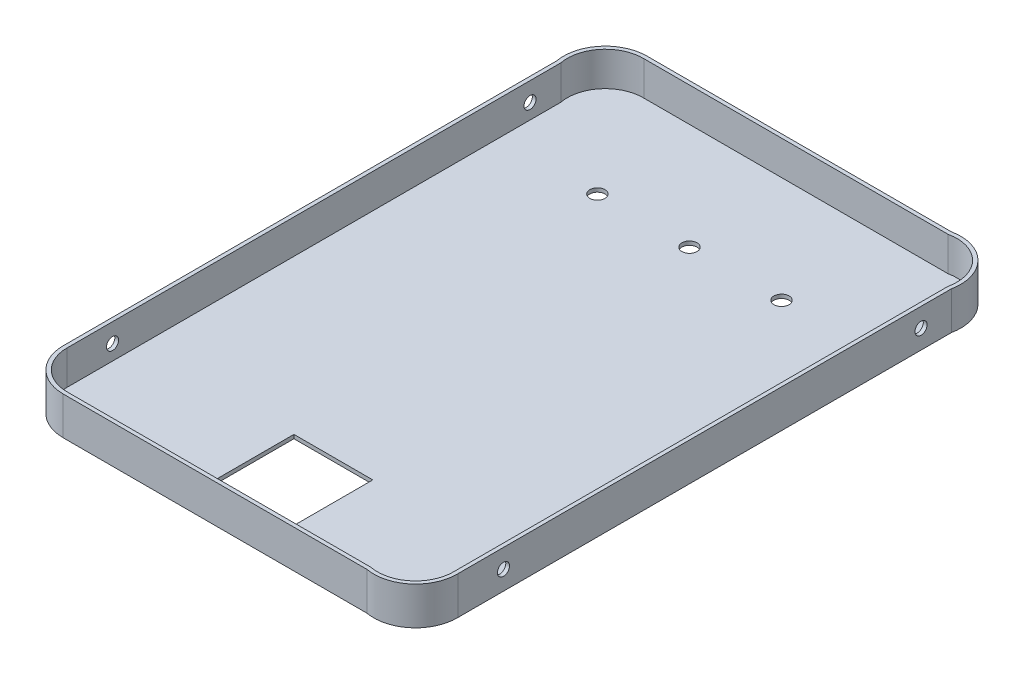
ISO-10303-21;
HEADER;
FILE_DESCRIPTION(('STEP AP214'),'2;1');
FILE_NAME('part.step','',(''),(''),'','','');
FILE_SCHEMA(('AUTOMOTIVE_DESIGN { 1 0 10303 214 1 1 1 1 }'));
ENDSEC;
DATA;
#1=APPLICATION_CONTEXT('core data for automotive mechanical design processes');
#2=APPLICATION_PROTOCOL_DEFINITION('international standard','automotive_design',2000,#1);
#3=PRODUCT_CONTEXT('',#1,'mechanical');
#4=PRODUCT('Part','Part','',(#3));
#5=PRODUCT_RELATED_PRODUCT_CATEGORY('part','',(#4));
#6=PRODUCT_DEFINITION_FORMATION('','',#4);
#7=PRODUCT_DEFINITION_CONTEXT('part definition',#1,'design');
#8=PRODUCT_DEFINITION('design','',#6,#7);
#9=PRODUCT_DEFINITION_SHAPE('','',#8);
#10=(LENGTH_UNIT() NAMED_UNIT(*) SI_UNIT(.MILLI.,.METRE.));
#11=(NAMED_UNIT(*) PLANE_ANGLE_UNIT() SI_UNIT($,.RADIAN.));
#12=(NAMED_UNIT(*) SI_UNIT($,.STERADIAN.) SOLID_ANGLE_UNIT());
#13=UNCERTAINTY_MEASURE_WITH_UNIT(LENGTH_MEASURE(1.E-05),#10,'distance_accuracy_value','');
#14=(GEOMETRIC_REPRESENTATION_CONTEXT(3) GLOBAL_UNCERTAINTY_ASSIGNED_CONTEXT((#13)) GLOBAL_UNIT_ASSIGNED_CONTEXT((#10,
#11,#12)) REPRESENTATION_CONTEXT('',''));
#15=CARTESIAN_POINT('',(0.,0.,0.));
#16=DIRECTION('',(0.,0.,1.));
#17=DIRECTION('',(1.,0.,0.));
#18=AXIS2_PLACEMENT_3D('',#15,#16,#17);
#19=CARTESIAN_POINT('',(-30.4217249440461,0.,-61.1681994947788));
#20=DIRECTION('',(0.,1.,0.));
#21=DIRECTION('',(0.,0.,1.));
#22=AXIS2_PLACEMENT_3D('',#19,#20,#21);
#23=PLANE('',#22);
#24=CARTESIAN_POINT('',(9.76190476190476,0.,-43.1640364931666));
#25=DIRECTION('',(0.,-1.,0.));
#26=DIRECTION('',(0.,0.,-1.));
#27=AXIS2_PLACEMENT_3D('',#24,#25,#26);
#28=CIRCLE('',#27,2.);
#29=CARTESIAN_POINT('',(9.76190476190476,0.,-45.1640364931666));
#30=VERTEX_POINT('',#29);
#31=EDGE_CURVE('E668',#30,#30,#28,.T.);
#32=ORIENTED_EDGE('',*,*,#31,.F.);
#33=EDGE_LOOP('',(#32));
#34=FACE_BOUND('',#33,.T.);
#35=CARTESIAN_POINT('',(-14.4880952380952,0.,-43.1640364931666));
#36=DIRECTION('',(0.,-1.,0.));
#37=DIRECTION('',(0.,0.,-1.));
#38=AXIS2_PLACEMENT_3D('',#35,#36,#37);
#39=CIRCLE('',#38,2.);
#40=CARTESIAN_POINT('',(-14.4880952380952,0.,-45.1640364931666));
#41=VERTEX_POINT('',#40);
#42=EDGE_CURVE('E203',#41,#41,#39,.T.);
#43=ORIENTED_EDGE('',*,*,#42,.F.);
#44=EDGE_LOOP('',(#43));
#45=FACE_BOUND('',#44,.T.);
#46=CARTESIAN_POINT('',(-30.4217249440461,0.,-61.1681994947788));
#47=DIRECTION('',(0.,1.,0.));
#48=DIRECTION('',(0.,0.,1.));
#49=AXIS2_PLACEMENT_3D('',#46,#47,#48);
#50=CIRCLE('',#49,11.);
#51=CARTESIAN_POINT('',(-30.2380952380952,0.,-72.1666666666666));
#52=VERTEX_POINT('',#51);
#53=CARTESIAN_POINT('',(-41.2380952380952,0.,-59.1666666666665));
#54=VERTEX_POINT('',#53);
#55=EDGE_CURVE('E239',#52,#54,#50,.T.);
#56=ORIENTED_EDGE('',*,*,#55,.F.);
#57=DIRECTION('',(-1.,0.,0.));
#58=VECTOR('',#57,1.);
#59=CARTESIAN_POINT('',(-30.2380952380952,0.,-72.1666666666666));
#60=LINE('',#59,#58);
#61=CARTESIAN_POINT('',(49.7619047619047,0.,-72.1666666666666));
#62=VERTEX_POINT('',#61);
#63=EDGE_CURVE('E298',#62,#52,#60,.T.);
#64=ORIENTED_EDGE('',*,*,#63,.F.);
#65=CARTESIAN_POINT('',(51.989902889246,0.,-61.3946647940078));
#66=DIRECTION('',(0.,1.,0.));
#67=DIRECTION('',(0.,0.,-1.));
#68=AXIS2_PLACEMENT_3D('',#65,#66,#67);
#69=CIRCLE('',#68,11.);
#70=CARTESIAN_POINT('',(62.7619047619048,0.,-59.1666666666665));
#71=VERTEX_POINT('',#70);
#72=EDGE_CURVE('E324',#71,#62,#69,.T.);
#73=ORIENTED_EDGE('',*,*,#72,.F.);
#74=DIRECTION('',(0.,0.,-1.));
#75=VECTOR('',#74,1.);
#76=CARTESIAN_POINT('',(62.7619047619048,0.,-59.1666666666665));
#77=LINE('',#76,#75);
#78=CARTESIAN_POINT('',(62.7619047619048,0.,70.8333333333333));
#79=VERTEX_POINT('',#78);
#80=EDGE_CURVE('E322',#79,#71,#77,.T.);
#81=ORIENTED_EDGE('',*,*,#80,.F.);
#82=CARTESIAN_POINT('',(51.763437590017,0.,71.0169630392843));
#83=DIRECTION('',(0.,1.,0.));
#84=DIRECTION('',(0.,0.,1.));
#85=AXIS2_PLACEMENT_3D('',#82,#83,#84);
#86=CIRCLE('',#85,11.);
#87=CARTESIAN_POINT('',(49.7619047619047,0.,81.8333333333334));
#88=VERTEX_POINT('',#87);
#89=EDGE_CURVE('E316',#88,#79,#86,.T.);
#90=ORIENTED_EDGE('',*,*,#89,.F.);
#91=DIRECTION('',(1.,0.,0.));
#92=VECTOR('',#91,1.);
#93=CARTESIAN_POINT('',(-30.2380952380951,0.,81.8333333333334));
#94=LINE('',#93,#92);
#95=CARTESIAN_POINT('',(-30.2380952380952,0.,81.8333333333334));
#96=VERTEX_POINT('',#95);
#97=EDGE_CURVE('E320',#96,#88,#94,.T.);
#98=ORIENTED_EDGE('',*,*,#97,.F.);
#99=CARTESIAN_POINT('',(-30.2380952380952,0.,70.8333333333334));
#100=DIRECTION('',(0.,1.,0.));
#101=DIRECTION('',(0.,0.,1.));
#102=AXIS2_PLACEMENT_3D('',#99,#100,#101);
#103=CIRCLE('',#102,11.);
#104=CARTESIAN_POINT('',(-41.2380952380952,0.,70.8333333333333));
#105=VERTEX_POINT('',#104);
#106=EDGE_CURVE('E314',#105,#96,#103,.T.);
#107=ORIENTED_EDGE('',*,*,#106,.F.);
#108=DIRECTION('',(0.,0.,1.));
#109=VECTOR('',#108,1.);
#110=CARTESIAN_POINT('',(-41.2380952380952,0.,-59.1666666666665));
#111=LINE('',#110,#109);
#112=EDGE_CURVE('E312',#54,#105,#111,.T.);
#113=ORIENTED_EDGE('',*,*,#112,.F.);
#114=EDGE_LOOP('',(#56,#64,#73,#81,#90,#98,#107,#113));
#115=FACE_BOUND('',#114,.T.);
#116=DIRECTION('',(1.,0.,0.));
#117=VECTOR('',#116,1.);
#118=CARTESIAN_POINT('',(0.375617944177974,0.,72.0118944147057));
#119=LINE('',#118,#117);
#120=CARTESIAN_POINT('',(0.375617944177974,0.,72.0118944147057));
#121=VERTEX_POINT('',#120);
#122=CARTESIAN_POINT('',(21.1481915796316,0.,72.0118944147057));
#123=VERTEX_POINT('',#122);
#124=EDGE_CURVE('E59',#121,#123,#119,.T.);
#125=ORIENTED_EDGE('',*,*,#124,.T.);
#126=DIRECTION('',(0.,0.,-1.));
#127=VECTOR('',#126,1.);
#128=CARTESIAN_POINT('',(21.1481915796316,0.,72.0118944147057));
#129=LINE('',#128,#127);
#130=CARTESIAN_POINT('',(21.1481915796316,0.,51.6547722519611));
#131=VERTEX_POINT('',#130);
#132=EDGE_CURVE('E189',#123,#131,#129,.T.);
#133=ORIENTED_EDGE('',*,*,#132,.T.);
#134=DIRECTION('',(1.,0.,0.));
#135=VECTOR('',#134,1.);
#136=CARTESIAN_POINT('',(0.375617944177974,0.,51.6547722519611));
#137=LINE('',#136,#135);
#138=CARTESIAN_POINT('',(0.375617944177974,0.,51.6547722519611));
#139=VERTEX_POINT('',#138);
#140=EDGE_CURVE('E191',#139,#131,#137,.T.);
#141=ORIENTED_EDGE('',*,*,#140,.F.);
#142=DIRECTION('',(0.,0.,-1.));
#143=VECTOR('',#142,1.);
#144=CARTESIAN_POINT('',(0.375617944177974,0.,72.0118944147057));
#145=LINE('',#144,#143);
#146=EDGE_CURVE('E199',#121,#139,#145,.T.);
#147=ORIENTED_EDGE('',*,*,#146,.F.);
#148=EDGE_LOOP('',(#125,#133,#141,#147));
#149=FACE_BOUND('',#148,.T.);
#150=CARTESIAN_POINT('',(34.0119047619048,0.,-43.1640364931666));
#151=DIRECTION('',(0.,1.,0.));
#152=DIRECTION('',(0.,0.,1.));
#153=AXIS2_PLACEMENT_3D('',#150,#151,#152);
#154=CIRCLE('',#153,2.);
#155=CARTESIAN_POINT('',(34.0119047619048,0.,-41.1640364931666));
#156=VERTEX_POINT('',#155);
#157=EDGE_CURVE('E204',#156,#156,#154,.T.);
#158=ORIENTED_EDGE('',*,*,#157,.T.);
#159=EDGE_LOOP('',(#158));
#160=FACE_BOUND('',#159,.T.);
#161=ADVANCED_FACE('F43',(#34,#45,#115,#149,#160),#23,.F.);
#162=CARTESIAN_POINT('',(-30.4217249440461,1.,-61.1681994947788));
#163=DIRECTION('',(0.,1.,0.));
#164=DIRECTION('',(0.,0.,1.));
#165=AXIS2_PLACEMENT_3D('',#162,#163,#164);
#166=PLANE('',#165);
#167=DIRECTION('',(0.,0.,1.));
#168=VECTOR('',#167,1.);
#169=CARTESIAN_POINT('',(21.1481915796316,1.,-61.1681994947788));
#170=LINE('',#169,#168);
#171=CARTESIAN_POINT('',(21.1481915796316,0.999999999999999,51.6547722519611));
#172=VERTEX_POINT('',#171);
#173=CARTESIAN_POINT('',(21.1481915796316,0.999999999999999,72.0118944147057));
#174=VERTEX_POINT('',#173);
#175=EDGE_CURVE('E51',#172,#174,#170,.T.);
#176=ORIENTED_EDGE('',*,*,#175,.T.);
#177=DIRECTION('',(-1.,0.,0.));
#178=VECTOR('',#177,1.);
#179=CARTESIAN_POINT('',(-30.421724944046,1.,72.0118944147057));
#180=LINE('',#179,#178);
#181=CARTESIAN_POINT('',(0.375617944177974,0.999999999999999,72.0118944147057));
#182=VERTEX_POINT('',#181);
#183=EDGE_CURVE('E11',#174,#182,#180,.T.);
#184=ORIENTED_EDGE('',*,*,#183,.T.);
#185=DIRECTION('',(0.,0.,1.));
#186=VECTOR('',#185,1.);
#187=CARTESIAN_POINT('',(0.375617944177974,1.,-61.1681994947788));
#188=LINE('',#187,#186);
#189=CARTESIAN_POINT('',(0.375617944177974,1.,51.6547722519611));
#190=VERTEX_POINT('',#189);
#191=EDGE_CURVE('E348',#190,#182,#188,.T.);
#192=ORIENTED_EDGE('',*,*,#191,.F.);
#193=DIRECTION('',(-1.,0.,0.));
#194=VECTOR('',#193,1.);
#195=CARTESIAN_POINT('',(-30.4217249440461,1.,51.6547722519611));
#196=LINE('',#195,#194);
#197=EDGE_CURVE('E353',#172,#190,#196,.T.);
#198=ORIENTED_EDGE('',*,*,#197,.F.);
#199=EDGE_LOOP('',(#176,#184,#192,#198));
#200=FACE_BOUND('',#199,.T.);
#201=CARTESIAN_POINT('',(-30.4217249440461,0.999999999999999,-61.1681994947788));
#202=DIRECTION('',(0.,1.,0.));
#203=DIRECTION('',(0.,0.,1.));
#204=AXIS2_PLACEMENT_3D('',#201,#202,#203);
#205=CIRCLE('',#204,10.);
#206=CARTESIAN_POINT('',(-30.2466414991315,1.,-71.1666666666666));
#207=VERTEX_POINT('',#206);
#208=CARTESIAN_POINT('',(-40.2380952380952,1.,-59.260616141394));
#209=VERTEX_POINT('',#208);
#210=EDGE_CURVE('E231',#207,#209,#205,.T.);
#211=ORIENTED_EDGE('',*,*,#210,.T.);
#212=DIRECTION('',(0.,0.,1.));
#213=VECTOR('',#212,1.);
#214=CARTESIAN_POINT('',(-40.2380952380952,0.999999999999999,-59.1666666666665));
#215=LINE('',#214,#213);
#216=CARTESIAN_POINT('',(-40.2380952380952,0.999999999999999,70.8333333333333));
#217=VERTEX_POINT('',#216);
#218=EDGE_CURVE('E236',#209,#217,#215,.T.);
#219=ORIENTED_EDGE('',*,*,#218,.T.);
#220=CARTESIAN_POINT('',(-30.2380952380952,0.999999999999999,70.8333333333334));
#221=DIRECTION('',(0.,1.,0.));
#222=DIRECTION('',(0.,0.,1.));
#223=AXIS2_PLACEMENT_3D('',#220,#221,#222);
#224=CIRCLE('',#223,10.);
#225=CARTESIAN_POINT('',(-30.2380952380952,0.999999999999999,80.8333333333334));
#226=VERTEX_POINT('',#225);
#227=EDGE_CURVE('E247',#217,#226,#224,.T.);
#228=ORIENTED_EDGE('',*,*,#227,.T.);
#229=DIRECTION('',(1.,0.,0.));
#230=VECTOR('',#229,1.);
#231=CARTESIAN_POINT('',(-30.2380952380951,0.999999999999999,80.8333333333334));
#232=LINE('',#231,#230);
#233=CARTESIAN_POINT('',(49.8558542366322,1.,80.8333333333334));
#234=VERTEX_POINT('',#233);
#235=EDGE_CURVE('E254',#226,#234,#232,.T.);
#236=ORIENTED_EDGE('',*,*,#235,.T.);
#237=CARTESIAN_POINT('',(51.763437590017,0.999999999999999,71.0169630392843));
#238=DIRECTION('',(0.,1.,0.));
#239=DIRECTION('',(0.,0.,1.));
#240=AXIS2_PLACEMENT_3D('',#237,#238,#239);
#241=CIRCLE('',#240,9.99999999999999);
#242=CARTESIAN_POINT('',(61.7619047619048,1.,70.8418795943699));
#243=VERTEX_POINT('',#242);
#244=EDGE_CURVE('E259',#234,#243,#241,.T.);
#245=ORIENTED_EDGE('',*,*,#244,.T.);
#246=DIRECTION('',(0.,0.,-1.));
#247=VECTOR('',#246,1.);
#248=CARTESIAN_POINT('',(61.7619047619048,0.999999999999999,-59.1666666666665));
#249=LINE('',#248,#247);
#250=CARTESIAN_POINT('',(61.7619047619048,1.,-59.2714645206573));
#251=VERTEX_POINT('',#250);
#252=EDGE_CURVE('E264',#243,#251,#249,.T.);
#253=ORIENTED_EDGE('',*,*,#252,.T.);
#254=CARTESIAN_POINT('',(51.989902889246,0.999999999999999,-61.3946647940078));
#255=DIRECTION('',(0.,1.,0.));
#256=DIRECTION('',(0.,0.,1.));
#257=AXIS2_PLACEMENT_3D('',#254,#255,#256);
#258=CIRCLE('',#257,10.);
#259=CARTESIAN_POINT('',(49.8667026158955,1.,-71.1666666666666));
#260=VERTEX_POINT('',#259);
#261=EDGE_CURVE('E270',#251,#260,#258,.T.);
#262=ORIENTED_EDGE('',*,*,#261,.T.);
#263=DIRECTION('',(-1.,0.,0.));
#264=VECTOR('',#263,1.);
#265=CARTESIAN_POINT('',(-30.2380952380952,0.999999999999999,-71.1666666666666));
#266=LINE('',#265,#264);
#267=EDGE_CURVE('E275',#260,#207,#266,.T.);
#268=ORIENTED_EDGE('',*,*,#267,.T.);
#269=EDGE_LOOP('',(#211,#219,#228,#236,#245,#253,#262,#268));
#270=FACE_BOUND('',#269,.T.);
#271=CARTESIAN_POINT('',(-14.4880952380952,1.,-43.1640364931666));
#272=DIRECTION('',(0.,1.,0.));
#273=DIRECTION('',(0.,0.,1.));
#274=AXIS2_PLACEMENT_3D('',#271,#272,#273);
#275=CIRCLE('',#274,2.);
#276=CARTESIAN_POINT('',(-14.4880952380952,1.,-41.1640364931666));
#277=VERTEX_POINT('',#276);
#278=EDGE_CURVE('E673',#277,#277,#275,.F.);
#279=ORIENTED_EDGE('',*,*,#278,.T.);
#280=EDGE_LOOP('',(#279));
#281=FACE_BOUND('',#280,.T.);
#282=CARTESIAN_POINT('',(9.76190476190476,1.,-43.1640364931666));
#283=DIRECTION('',(0.,1.,0.));
#284=DIRECTION('',(0.,0.,1.));
#285=AXIS2_PLACEMENT_3D('',#282,#283,#284);
#286=CIRCLE('',#285,2.);
#287=CARTESIAN_POINT('',(9.76190476190476,1.,-41.1640364931666));
#288=VERTEX_POINT('',#287);
#289=EDGE_CURVE('E670',#288,#288,#286,.F.);
#290=ORIENTED_EDGE('',*,*,#289,.T.);
#291=EDGE_LOOP('',(#290));
#292=FACE_BOUND('',#291,.T.);
#293=CARTESIAN_POINT('',(34.0119047619048,1.,-43.1640364931666));
#294=DIRECTION('',(0.,1.,0.));
#295=DIRECTION('',(0.,0.,1.));
#296=AXIS2_PLACEMENT_3D('',#293,#294,#295);
#297=CIRCLE('',#296,2.);
#298=CARTESIAN_POINT('',(34.0119047619048,1.,-41.1640364931666));
#299=VERTEX_POINT('',#298);
#300=EDGE_CURVE('E198',#299,#299,#297,.T.);
#301=ORIENTED_EDGE('',*,*,#300,.F.);
#302=EDGE_LOOP('',(#301));
#303=FACE_BOUND('',#302,.T.);
#304=ADVANCED_FACE('F356',(#200,#270,#281,#292,#303),#166,.T.);
#305=CARTESIAN_POINT('',(-41.2380952380952,10.,-59.1666666666665));
#306=DIRECTION('',(1.,0.,0.));
#307=DIRECTION('',(0.,0.,-1.));
#308=AXIS2_PLACEMENT_3D('',#305,#306,#307);
#309=PLANE('',#308);
#310=ORIENTED_EDGE('',*,*,#112,.T.);
#311=DIRECTION('',(0.,-1.,0.));
#312=VECTOR('',#311,1.);
#313=CARTESIAN_POINT('',(-41.2380952380952,10.,70.8333333333333));
#314=LINE('',#313,#312);
#315=CARTESIAN_POINT('',(-41.2380952380952,10.,70.8333333333333));
#316=VERTEX_POINT('',#315);
#317=EDGE_CURVE('E344',#316,#105,#314,.T.);
#318=ORIENTED_EDGE('',*,*,#317,.F.);
#319=DIRECTION('',(0.,0.,1.));
#320=VECTOR('',#319,1.);
#321=CARTESIAN_POINT('',(-41.2380952380952,10.,-59.1666666666665));
#322=LINE('',#321,#320);
#323=CARTESIAN_POINT('',(-41.2380952380952,10.,-59.1666666666665));
#324=VERTEX_POINT('',#323);
#325=EDGE_CURVE('E294',#324,#316,#322,.T.);
#326=ORIENTED_EDGE('',*,*,#325,.F.);
#327=DIRECTION('',(0.,-1.,0.));
#328=VECTOR('',#327,1.);
#329=CARTESIAN_POINT('',(-41.2380952380952,10.,-59.1666666666665));
#330=LINE('',#329,#328);
#331=EDGE_CURVE('E346',#324,#54,#330,.T.);
#332=ORIENTED_EDGE('',*,*,#331,.T.);
#333=EDGE_LOOP('',(#310,#318,#326,#332));
#334=FACE_BOUND('',#333,.T.);
#335=CARTESIAN_POINT('',(-41.2380952380952,5.,58.8333333333335));
#336=DIRECTION('',(1.,0.,0.));
#337=DIRECTION('',(0.,0.,-1.));
#338=AXIS2_PLACEMENT_3D('',#335,#336,#337);
#339=CIRCLE('',#338,1.6);
#340=CARTESIAN_POINT('',(-41.2380952380952,5.,57.2333333333335));
#341=VERTEX_POINT('',#340);
#342=EDGE_CURVE('E220',#341,#341,#339,.F.);
#343=ORIENTED_EDGE('',*,*,#342,.F.);
#344=EDGE_LOOP('',(#343));
#345=FACE_BOUND('',#344,.T.);
#346=CARTESIAN_POINT('',(-41.2380952380952,5.,-51.1666666666665));
#347=DIRECTION('',(1.,0.,0.));
#348=DIRECTION('',(0.,0.,-1.));
#349=AXIS2_PLACEMENT_3D('',#346,#347,#348);
#350=CIRCLE('',#349,1.6);
#351=CARTESIAN_POINT('',(-41.2380952380952,5.,-52.7666666666665));
#352=VERTEX_POINT('',#351);
#353=EDGE_CURVE('E229',#352,#352,#350,.T.);
#354=ORIENTED_EDGE('',*,*,#353,.T.);
#355=EDGE_LOOP('',(#354));
#356=FACE_BOUND('',#355,.T.);
#357=ADVANCED_FACE('F382',(#334,#345,#356),#309,.F.);
#358=CARTESIAN_POINT('',(62.7619047619048,10.,-59.1666666666665));
#359=DIRECTION('',(-1.,0.,0.));
#360=DIRECTION('',(0.,0.,1.));
#361=AXIS2_PLACEMENT_3D('',#358,#359,#360);
#362=PLANE('',#361);
#363=ORIENTED_EDGE('',*,*,#80,.T.);
#364=DIRECTION('',(0.,-1.,0.));
#365=VECTOR('',#364,1.);
#366=CARTESIAN_POINT('',(62.7619047619048,10.,-59.1666666666665));
#367=LINE('',#366,#365);
#368=CARTESIAN_POINT('',(62.7619047619048,10.,-59.1666666666665));
#369=VERTEX_POINT('',#368);
#370=EDGE_CURVE('E332',#369,#71,#367,.T.);
#371=ORIENTED_EDGE('',*,*,#370,.F.);
#372=DIRECTION('',(0.,0.,-1.));
#373=VECTOR('',#372,1.);
#374=CARTESIAN_POINT('',(62.7619047619048,10.,-59.1666666666665));
#375=LINE('',#374,#373);
#376=CARTESIAN_POINT('',(62.7619047619048,10.,70.8333333333333));
#377=VERTEX_POINT('',#376);
#378=EDGE_CURVE('E302',#377,#369,#375,.T.);
#379=ORIENTED_EDGE('',*,*,#378,.F.);
#380=DIRECTION('',(0.,-1.,0.));
#381=VECTOR('',#380,1.);
#382=CARTESIAN_POINT('',(62.7619047619048,10.,70.8333333333333));
#383=LINE('',#382,#381);
#384=EDGE_CURVE('E331',#377,#79,#383,.T.);
#385=ORIENTED_EDGE('',*,*,#384,.T.);
#386=EDGE_LOOP('',(#363,#371,#379,#385));
#387=FACE_BOUND('',#386,.T.);
#388=CARTESIAN_POINT('',(62.7619047619048,5.,58.8333333333335));
#389=DIRECTION('',(-1.,0.,0.));
#390=DIRECTION('',(0.,0.,1.));
#391=AXIS2_PLACEMENT_3D('',#388,#389,#390);
#392=CIRCLE('',#391,1.6);
#393=CARTESIAN_POINT('',(62.7619047619048,5.,60.4333333333335));
#394=VERTEX_POINT('',#393);
#395=EDGE_CURVE('E217',#394,#394,#392,.F.);
#396=ORIENTED_EDGE('',*,*,#395,.F.);
#397=EDGE_LOOP('',(#396));
#398=FACE_BOUND('',#397,.T.);
#399=CARTESIAN_POINT('',(62.7619047619048,5.,-51.1666666666665));
#400=DIRECTION('',(-1.,0.,0.));
#401=DIRECTION('',(0.,0.,1.));
#402=AXIS2_PLACEMENT_3D('',#399,#400,#401);
#403=CIRCLE('',#402,1.6);
#404=CARTESIAN_POINT('',(62.7619047619048,5.,-49.5666666666665));
#405=VERTEX_POINT('',#404);
#406=EDGE_CURVE('E227',#405,#405,#403,.T.);
#407=ORIENTED_EDGE('',*,*,#406,.T.);
#408=EDGE_LOOP('',(#407));
#409=FACE_BOUND('',#408,.T.);
#410=ADVANCED_FACE('F399',(#387,#398,#409),#362,.F.);
#411=CARTESIAN_POINT('',(-40.2380952380952,10.,-59.1666666666665));
#412=DIRECTION('',(1.,0.,0.));
#413=DIRECTION('',(0.,0.,-1.));
#414=AXIS2_PLACEMENT_3D('',#411,#412,#413);
#415=PLANE('',#414);
#416=CARTESIAN_POINT('',(-40.2380952380952,5.,58.8333333333335));
#417=DIRECTION('',(1.,0.,0.));
#418=DIRECTION('',(0.,0.,-1.));
#419=AXIS2_PLACEMENT_3D('',#416,#417,#418);
#420=CIRCLE('',#419,1.6);
#421=CARTESIAN_POINT('',(-40.2380952380952,5.,57.2333333333335));
#422=VERTEX_POINT('',#421);
#423=EDGE_CURVE('E211',#422,#422,#420,.F.);
#424=ORIENTED_EDGE('',*,*,#423,.T.);
#425=EDGE_LOOP('',(#424));
#426=FACE_BOUND('',#425,.T.);
#427=ORIENTED_EDGE('',*,*,#218,.F.);
#428=DIRECTION('',(0.,-1.,0.));
#429=VECTOR('',#428,1.);
#430=CARTESIAN_POINT('',(-40.2380952380952,10.,-59.260616141394));
#431=LINE('',#430,#429);
#432=CARTESIAN_POINT('',(-40.2380952380952,10.,-59.260616141394));
#433=VERTEX_POINT('',#432);
#434=EDGE_CURVE('E240',#433,#209,#431,.T.);
#435=ORIENTED_EDGE('',*,*,#434,.F.);
#436=DIRECTION('',(0.,0.,1.));
#437=VECTOR('',#436,1.);
#438=CARTESIAN_POINT('',(-40.2380952380952,10.,-59.1666666666665));
#439=LINE('',#438,#437);
#440=CARTESIAN_POINT('',(-40.2380952380952,10.,70.8333333333333));
#441=VERTEX_POINT('',#440);
#442=EDGE_CURVE('E279',#433,#441,#439,.T.);
#443=ORIENTED_EDGE('',*,*,#442,.T.);
#444=DIRECTION('',(0.,-1.,0.));
#445=VECTOR('',#444,1.);
#446=CARTESIAN_POINT('',(-40.2380952380952,10.,70.8333333333333));
#447=LINE('',#446,#445);
#448=EDGE_CURVE('E241',#441,#217,#447,.T.);
#449=ORIENTED_EDGE('',*,*,#448,.T.);
#450=EDGE_LOOP('',(#427,#435,#443,#449));
#451=FACE_BOUND('',#450,.T.);
#452=CARTESIAN_POINT('',(-40.2380952380952,5.,-51.1666666666665));
#453=DIRECTION('',(1.,0.,0.));
#454=DIRECTION('',(0.,0.,-1.));
#455=AXIS2_PLACEMENT_3D('',#452,#453,#454);
#456=CIRCLE('',#455,1.6);
#457=CARTESIAN_POINT('',(-40.2380952380952,5.,-52.7666666666665));
#458=VERTEX_POINT('',#457);
#459=EDGE_CURVE('E221',#458,#458,#456,.T.);
#460=ORIENTED_EDGE('',*,*,#459,.F.);
#461=EDGE_LOOP('',(#460));
#462=FACE_BOUND('',#461,.T.);
#463=ADVANCED_FACE('F398',(#426,#451,#462),#415,.T.);
#464=CARTESIAN_POINT('',(61.7619047619048,10.,-59.1666666666665));
#465=DIRECTION('',(-1.,0.,0.));
#466=DIRECTION('',(0.,0.,1.));
#467=AXIS2_PLACEMENT_3D('',#464,#465,#466);
#468=PLANE('',#467);
#469=CARTESIAN_POINT('',(61.7619047619048,5.,58.8333333333335));
#470=DIRECTION('',(-1.,0.,0.));
#471=DIRECTION('',(0.,0.,1.));
#472=AXIS2_PLACEMENT_3D('',#469,#470,#471);
#473=CIRCLE('',#472,1.6);
#474=CARTESIAN_POINT('',(61.7619047619048,5.,60.4333333333335));
#475=VERTEX_POINT('',#474);
#476=EDGE_CURVE('E183',#475,#475,#473,.F.);
#477=ORIENTED_EDGE('',*,*,#476,.T.);
#478=EDGE_LOOP('',(#477));
#479=FACE_BOUND('',#478,.T.);
#480=ORIENTED_EDGE('',*,*,#252,.F.);
#481=DIRECTION('',(0.,-1.,0.));
#482=VECTOR('',#481,1.);
#483=CARTESIAN_POINT('',(61.7619047619048,10.,70.8418795943699));
#484=LINE('',#483,#482);
#485=CARTESIAN_POINT('',(61.7619047619048,10.,70.8418795943699));
#486=VERTEX_POINT('',#485);
#487=EDGE_CURVE('E261',#486,#243,#484,.T.);
#488=ORIENTED_EDGE('',*,*,#487,.F.);
#489=DIRECTION('',(0.,0.,-1.));
#490=VECTOR('',#489,1.);
#491=CARTESIAN_POINT('',(61.7619047619048,10.,-59.1666666666665));
#492=LINE('',#491,#490);
#493=CARTESIAN_POINT('',(61.7619047619048,10.,-59.2714645206573));
#494=VERTEX_POINT('',#493);
#495=EDGE_CURVE('E287',#486,#494,#492,.T.);
#496=ORIENTED_EDGE('',*,*,#495,.T.);
#497=DIRECTION('',(0.,-1.,0.));
#498=VECTOR('',#497,1.);
#499=CARTESIAN_POINT('',(61.7619047619048,10.,-59.2714645206573));
#500=LINE('',#499,#498);
#501=EDGE_CURVE('E267',#494,#251,#500,.T.);
#502=ORIENTED_EDGE('',*,*,#501,.T.);
#503=EDGE_LOOP('',(#480,#488,#496,#502));
#504=FACE_BOUND('',#503,.T.);
#505=CARTESIAN_POINT('',(61.7619047619048,5.,-51.1666666666665));
#506=DIRECTION('',(-1.,0.,0.));
#507=DIRECTION('',(0.,0.,1.));
#508=AXIS2_PLACEMENT_3D('',#505,#506,#507);
#509=CIRCLE('',#508,1.6);
#510=CARTESIAN_POINT('',(61.7619047619048,5.,-49.5666666666665));
#511=VERTEX_POINT('',#510);
#512=EDGE_CURVE('E225',#511,#511,#509,.T.);
#513=ORIENTED_EDGE('',*,*,#512,.F.);
#514=EDGE_LOOP('',(#513));
#515=FACE_BOUND('',#514,.T.);
#516=ADVANCED_FACE('F448',(#479,#504,#515),#468,.T.);
#517=CARTESIAN_POINT('',(-30.4217249440461,10.,-61.1681994947788));
#518=DIRECTION('',(0.,-1.,0.));
#519=DIRECTION('',(0.,0.,-1.));
#520=AXIS2_PLACEMENT_3D('',#517,#518,#519);
#521=CYLINDRICAL_SURFACE('',#520,11.);
#522=ORIENTED_EDGE('',*,*,#55,.T.);
#523=ORIENTED_EDGE('',*,*,#331,.F.);
#524=CARTESIAN_POINT('',(-30.4217249440461,10.,-61.1681994947788));
#525=DIRECTION('',(0.,1.,0.));
#526=DIRECTION('',(0.,0.,1.));
#527=AXIS2_PLACEMENT_3D('',#524,#525,#526);
#528=CIRCLE('',#527,11.);
#529=CARTESIAN_POINT('',(-30.2380952380952,10.,-72.1666666666666));
#530=VERTEX_POINT('',#529);
#531=EDGE_CURVE('E292',#530,#324,#528,.T.);
#532=ORIENTED_EDGE('',*,*,#531,.F.);
#533=DIRECTION('',(0.,-1.,0.));
#534=VECTOR('',#533,1.);
#535=CARTESIAN_POINT('',(-30.2380952380952,10.,-72.1666666666666));
#536=LINE('',#535,#534);
#537=EDGE_CURVE('E309',#530,#52,#536,.T.);
#538=ORIENTED_EDGE('',*,*,#537,.T.);
#539=EDGE_LOOP('',(#522,#523,#532,#538));
#540=FACE_BOUND('',#539,.T.);
#541=ADVANCED_FACE('F44',(#540),#521,.T.);
#542=CARTESIAN_POINT('',(-30.2380952380952,10.,70.8333333333334));
#543=DIRECTION('',(0.,-1.,0.));
#544=DIRECTION('',(0.,0.,-1.));
#545=AXIS2_PLACEMENT_3D('',#542,#543,#544);
#546=CYLINDRICAL_SURFACE('',#545,11.);
#547=ORIENTED_EDGE('',*,*,#106,.T.);
#548=DIRECTION('',(0.,-1.,0.));
#549=VECTOR('',#548,1.);
#550=CARTESIAN_POINT('',(-30.2380952380952,10.,81.8333333333334));
#551=LINE('',#550,#549);
#552=CARTESIAN_POINT('',(-30.2380952380952,10.,81.8333333333334));
#553=VERTEX_POINT('',#552);
#554=EDGE_CURVE('E338',#553,#96,#551,.T.);
#555=ORIENTED_EDGE('',*,*,#554,.F.);
#556=CARTESIAN_POINT('',(-30.2380952380952,10.,70.8333333333334));
#557=DIRECTION('',(0.,1.,0.));
#558=DIRECTION('',(0.,0.,1.));
#559=AXIS2_PLACEMENT_3D('',#556,#557,#558);
#560=CIRCLE('',#559,11.);
#561=EDGE_CURVE('E296',#316,#553,#560,.T.);
#562=ORIENTED_EDGE('',*,*,#561,.F.);
#563=ORIENTED_EDGE('',*,*,#317,.T.);
#564=EDGE_LOOP('',(#547,#555,#562,#563));
#565=FACE_BOUND('',#564,.T.);
#566=ADVANCED_FACE('F409',(#565),#546,.T.);
#567=CARTESIAN_POINT('',(-30.2380952380951,10.,81.8333333333334));
#568=DIRECTION('',(0.,0.,-1.));
#569=DIRECTION('',(-1.,0.,0.));
#570=AXIS2_PLACEMENT_3D('',#567,#568,#569);
#571=PLANE('',#570);
#572=ORIENTED_EDGE('',*,*,#97,.T.);
#573=DIRECTION('',(0.,-1.,0.));
#574=VECTOR('',#573,1.);
#575=CARTESIAN_POINT('',(49.7619047619047,10.,81.8333333333334));
#576=LINE('',#575,#574);
#577=CARTESIAN_POINT('',(49.7619047619047,10.,81.8333333333334));
#578=VERTEX_POINT('',#577);
#579=EDGE_CURVE('E340',#578,#88,#576,.T.);
#580=ORIENTED_EDGE('',*,*,#579,.F.);
#581=DIRECTION('',(1.,0.,0.));
#582=VECTOR('',#581,1.);
#583=CARTESIAN_POINT('',(-30.2380952380951,10.,81.8333333333334));
#584=LINE('',#583,#582);
#585=EDGE_CURVE('E297',#553,#578,#584,.T.);
#586=ORIENTED_EDGE('',*,*,#585,.F.);
#587=ORIENTED_EDGE('',*,*,#554,.T.);
#588=EDGE_LOOP('',(#572,#580,#586,#587));
#589=FACE_BOUND('',#588,.T.);
#590=ADVANCED_FACE('F404',(#589),#571,.F.);
#591=CARTESIAN_POINT('',(51.763437590017,10.,71.0169630392843));
#592=DIRECTION('',(0.,-1.,0.));
#593=DIRECTION('',(0.,0.,-1.));
#594=AXIS2_PLACEMENT_3D('',#591,#592,#593);
#595=CYLINDRICAL_SURFACE('',#594,11.);
#596=ORIENTED_EDGE('',*,*,#89,.T.);
#597=ORIENTED_EDGE('',*,*,#384,.F.);
#598=CARTESIAN_POINT('',(51.763437590017,10.,71.0169630392843));
#599=DIRECTION('',(0.,1.,0.));
#600=DIRECTION('',(0.,0.,1.));
#601=AXIS2_PLACEMENT_3D('',#598,#599,#600);
#602=CIRCLE('',#601,11.);
#603=EDGE_CURVE('E305',#578,#377,#602,.T.);
#604=ORIENTED_EDGE('',*,*,#603,.F.);
#605=ORIENTED_EDGE('',*,*,#579,.T.);
#606=EDGE_LOOP('',(#596,#597,#604,#605));
#607=FACE_BOUND('',#606,.T.);
#608=ADVANCED_FACE('F395',(#607),#595,.T.);
#609=CARTESIAN_POINT('',(51.989902889246,10.,-61.3946647940078));
#610=DIRECTION('',(0.,-1.,0.));
#611=DIRECTION('',(0.,0.,-1.));
#612=AXIS2_PLACEMENT_3D('',#609,#610,#611);
#613=CYLINDRICAL_SURFACE('',#612,11.);
#614=ORIENTED_EDGE('',*,*,#72,.T.);
#615=DIRECTION('',(0.,-1.,0.));
#616=VECTOR('',#615,1.);
#617=CARTESIAN_POINT('',(49.7619047619047,10.,-72.1666666666666));
#618=LINE('',#617,#616);
#619=CARTESIAN_POINT('',(49.7619047619047,10.,-72.1666666666666));
#620=VERTEX_POINT('',#619);
#621=EDGE_CURVE('E329',#620,#62,#618,.T.);
#622=ORIENTED_EDGE('',*,*,#621,.F.);
#623=CARTESIAN_POINT('',(51.989902889246,10.,-61.3946647940078));
#624=DIRECTION('',(0.,1.,0.));
#625=DIRECTION('',(0.,0.,-1.));
#626=AXIS2_PLACEMENT_3D('',#623,#624,#625);
#627=CIRCLE('',#626,11.);
#628=EDGE_CURVE('E306',#369,#620,#627,.T.);
#629=ORIENTED_EDGE('',*,*,#628,.F.);
#630=ORIENTED_EDGE('',*,*,#370,.T.);
#631=EDGE_LOOP('',(#614,#622,#629,#630));
#632=FACE_BOUND('',#631,.T.);
#633=ADVANCED_FACE('F391',(#632),#613,.T.);
#634=CARTESIAN_POINT('',(-30.2380952380952,10.,-72.1666666666666));
#635=DIRECTION('',(0.,0.,1.));
#636=DIRECTION('',(1.,0.,0.));
#637=AXIS2_PLACEMENT_3D('',#634,#635,#636);
#638=PLANE('',#637);
#639=ORIENTED_EDGE('',*,*,#63,.T.);
#640=ORIENTED_EDGE('',*,*,#537,.F.);
#641=DIRECTION('',(-1.,0.,0.));
#642=VECTOR('',#641,1.);
#643=CARTESIAN_POINT('',(-30.2380952380952,10.,-72.1666666666666));
#644=LINE('',#643,#642);
#645=EDGE_CURVE('E308',#620,#530,#644,.T.);
#646=ORIENTED_EDGE('',*,*,#645,.F.);
#647=ORIENTED_EDGE('',*,*,#621,.T.);
#648=EDGE_LOOP('',(#639,#640,#646,#647));
#649=FACE_BOUND('',#648,.T.);
#650=ADVANCED_FACE('F389',(#649),#638,.F.);
#651=CARTESIAN_POINT('',(-30.4217249440461,10.,-61.1681994947788));
#652=DIRECTION('',(0.,1.,0.));
#653=DIRECTION('',(0.,0.,1.));
#654=AXIS2_PLACEMENT_3D('',#651,#652,#653);
#655=PLANE('',#654);
#656=CARTESIAN_POINT('',(-30.4217249440461,10.,-61.1681994947788));
#657=DIRECTION('',(0.,1.,0.));
#658=DIRECTION('',(0.,0.,1.));
#659=AXIS2_PLACEMENT_3D('',#656,#657,#658);
#660=CIRCLE('',#659,10.);
#661=CARTESIAN_POINT('',(-30.2466414991315,10.,-71.1666666666666));
#662=VERTEX_POINT('',#661);
#663=EDGE_CURVE('E277',#662,#433,#660,.T.);
#664=ORIENTED_EDGE('',*,*,#663,.F.);
#665=DIRECTION('',(-1.,0.,0.));
#666=VECTOR('',#665,1.);
#667=CARTESIAN_POINT('',(-30.2380952380952,10.,-71.1666666666666));
#668=LINE('',#667,#666);
#669=CARTESIAN_POINT('',(49.8667026158955,10.,-71.1666666666666));
#670=VERTEX_POINT('',#669);
#671=EDGE_CURVE('E246',#670,#662,#668,.T.);
#672=ORIENTED_EDGE('',*,*,#671,.F.);
#673=CARTESIAN_POINT('',(51.989902889246,10.,-61.3946647940078));
#674=DIRECTION('',(0.,1.,0.));
#675=DIRECTION('',(0.,0.,1.));
#676=AXIS2_PLACEMENT_3D('',#673,#674,#675);
#677=CIRCLE('',#676,10.);
#678=EDGE_CURVE('E290',#494,#670,#677,.T.);
#679=ORIENTED_EDGE('',*,*,#678,.F.);
#680=ORIENTED_EDGE('',*,*,#495,.F.);
#681=CARTESIAN_POINT('',(51.763437590017,10.,71.0169630392843));
#682=DIRECTION('',(0.,1.,0.));
#683=DIRECTION('',(0.,0.,1.));
#684=AXIS2_PLACEMENT_3D('',#681,#682,#683);
#685=CIRCLE('',#684,9.99999999999999);
#686=CARTESIAN_POINT('',(49.8558542366322,10.,80.8333333333334));
#687=VERTEX_POINT('',#686);
#688=EDGE_CURVE('E283',#687,#486,#685,.T.);
#689=ORIENTED_EDGE('',*,*,#688,.F.);
#690=DIRECTION('',(1.,0.,0.));
#691=VECTOR('',#690,1.);
#692=CARTESIAN_POINT('',(-30.2380952380951,10.,80.8333333333334));
#693=LINE('',#692,#691);
#694=CARTESIAN_POINT('',(-30.2380952380952,10.,80.8333333333334));
#695=VERTEX_POINT('',#694);
#696=EDGE_CURVE('E282',#695,#687,#693,.T.);
#697=ORIENTED_EDGE('',*,*,#696,.F.);
#698=CARTESIAN_POINT('',(-30.2380952380952,10.,70.8333333333334));
#699=DIRECTION('',(0.,1.,0.));
#700=DIRECTION('',(0.,0.,1.));
#701=AXIS2_PLACEMENT_3D('',#698,#699,#700);
#702=CIRCLE('',#701,10.);
#703=EDGE_CURVE('E278',#441,#695,#702,.T.);
#704=ORIENTED_EDGE('',*,*,#703,.F.);
#705=ORIENTED_EDGE('',*,*,#442,.F.);
#706=EDGE_LOOP('',(#664,#672,#679,#680,#689,#697,#704,#705));
#707=FACE_BOUND('',#706,.T.);
#708=ORIENTED_EDGE('',*,*,#531,.T.);
#709=ORIENTED_EDGE('',*,*,#325,.T.);
#710=ORIENTED_EDGE('',*,*,#561,.T.);
#711=ORIENTED_EDGE('',*,*,#585,.T.);
#712=ORIENTED_EDGE('',*,*,#603,.T.);
#713=ORIENTED_EDGE('',*,*,#378,.T.);
#714=ORIENTED_EDGE('',*,*,#628,.T.);
#715=ORIENTED_EDGE('',*,*,#645,.T.);
#716=EDGE_LOOP('',(#708,#709,#710,#711,#712,#713,#714,#715));
#717=FACE_BOUND('',#716,.T.);
#718=ADVANCED_FACE('F390',(#707,#717),#655,.T.);
#719=CARTESIAN_POINT('',(-30.4217249440461,10.,-61.1681994947788));
#720=DIRECTION('',(0.,-1.,0.));
#721=DIRECTION('',(0.,0.,-1.));
#722=AXIS2_PLACEMENT_3D('',#719,#720,#721);
#723=CYLINDRICAL_SURFACE('',#722,10.);
#724=ORIENTED_EDGE('',*,*,#210,.F.);
#725=DIRECTION('',(0.,-1.,0.));
#726=VECTOR('',#725,1.);
#727=CARTESIAN_POINT('',(-30.2466414991315,10.,-71.1666666666666));
#728=LINE('',#727,#726);
#729=EDGE_CURVE('E245',#662,#207,#728,.T.);
#730=ORIENTED_EDGE('',*,*,#729,.F.);
#731=ORIENTED_EDGE('',*,*,#663,.T.);
#732=ORIENTED_EDGE('',*,*,#434,.T.);
#733=EDGE_LOOP('',(#724,#730,#731,#732));
#734=FACE_BOUND('',#733,.T.);
#735=ADVANCED_FACE('F487',(#734),#723,.F.);
#736=CARTESIAN_POINT('',(-30.2380952380952,10.,70.8333333333334));
#737=DIRECTION('',(0.,-1.,0.));
#738=DIRECTION('',(0.,0.,-1.));
#739=AXIS2_PLACEMENT_3D('',#736,#737,#738);
#740=CYLINDRICAL_SURFACE('',#739,10.);
#741=ORIENTED_EDGE('',*,*,#227,.F.);
#742=ORIENTED_EDGE('',*,*,#448,.F.);
#743=ORIENTED_EDGE('',*,*,#703,.T.);
#744=DIRECTION('',(0.,1.,0.));
#745=VECTOR('',#744,1.);
#746=CARTESIAN_POINT('',(-30.2380952380952,10.,80.8333333333334));
#747=LINE('',#746,#745);
#748=EDGE_CURVE('E252',#695,#226,#747,.F.);
#749=ORIENTED_EDGE('',*,*,#748,.T.);
#750=EDGE_LOOP('',(#741,#742,#743,#749));
#751=FACE_BOUND('',#750,.T.);
#752=ADVANCED_FACE('F498',(#751),#740,.F.);
#753=CARTESIAN_POINT('',(-30.2380952380951,10.,80.8333333333334));
#754=DIRECTION('',(0.,0.,-1.));
#755=DIRECTION('',(-1.,0.,0.));
#756=AXIS2_PLACEMENT_3D('',#753,#754,#755);
#757=PLANE('',#756);
#758=ORIENTED_EDGE('',*,*,#235,.F.);
#759=ORIENTED_EDGE('',*,*,#748,.F.);
#760=ORIENTED_EDGE('',*,*,#696,.T.);
#761=DIRECTION('',(0.,-1.,0.));
#762=VECTOR('',#761,1.);
#763=CARTESIAN_POINT('',(49.8558542366322,10.,80.8333333333334));
#764=LINE('',#763,#762);
#765=EDGE_CURVE('E257',#687,#234,#764,.T.);
#766=ORIENTED_EDGE('',*,*,#765,.T.);
#767=EDGE_LOOP('',(#758,#759,#760,#766));
#768=FACE_BOUND('',#767,.T.);
#769=ADVANCED_FACE('F501',(#768),#757,.T.);
#770=CARTESIAN_POINT('',(51.763437590017,10.,71.0169630392843));
#771=DIRECTION('',(0.,-1.,0.));
#772=DIRECTION('',(0.,0.,-1.));
#773=AXIS2_PLACEMENT_3D('',#770,#771,#772);
#774=CYLINDRICAL_SURFACE('',#773,9.99999999999999);
#775=ORIENTED_EDGE('',*,*,#244,.F.);
#776=ORIENTED_EDGE('',*,*,#765,.F.);
#777=ORIENTED_EDGE('',*,*,#688,.T.);
#778=ORIENTED_EDGE('',*,*,#487,.T.);
#779=EDGE_LOOP('',(#775,#776,#777,#778));
#780=FACE_BOUND('',#779,.T.);
#781=ADVANCED_FACE('F464',(#780),#774,.F.);
#782=CARTESIAN_POINT('',(51.989902889246,10.,-61.3946647940078));
#783=DIRECTION('',(0.,-1.,0.));
#784=DIRECTION('',(0.,0.,-1.));
#785=AXIS2_PLACEMENT_3D('',#782,#783,#784);
#786=CYLINDRICAL_SURFACE('',#785,10.);
#787=ORIENTED_EDGE('',*,*,#261,.F.);
#788=ORIENTED_EDGE('',*,*,#501,.F.);
#789=ORIENTED_EDGE('',*,*,#678,.T.);
#790=DIRECTION('',(0.,-1.,0.));
#791=VECTOR('',#790,1.);
#792=CARTESIAN_POINT('',(49.8667026158955,10.,-71.1666666666666));
#793=LINE('',#792,#791);
#794=EDGE_CURVE('E244',#670,#260,#793,.T.);
#795=ORIENTED_EDGE('',*,*,#794,.T.);
#796=EDGE_LOOP('',(#787,#788,#789,#795));
#797=FACE_BOUND('',#796,.T.);
#798=ADVANCED_FACE('F461',(#797),#786,.F.);
#799=CARTESIAN_POINT('',(-30.2380952380952,10.,-71.1666666666666));
#800=DIRECTION('',(0.,0.,1.));
#801=DIRECTION('',(1.,0.,0.));
#802=AXIS2_PLACEMENT_3D('',#799,#800,#801);
#803=PLANE('',#802);
#804=ORIENTED_EDGE('',*,*,#267,.F.);
#805=ORIENTED_EDGE('',*,*,#794,.F.);
#806=ORIENTED_EDGE('',*,*,#671,.T.);
#807=ORIENTED_EDGE('',*,*,#729,.T.);
#808=EDGE_LOOP('',(#804,#805,#806,#807));
#809=FACE_BOUND('',#808,.T.);
#810=ADVANCED_FACE('F442',(#809),#803,.T.);
#811=CARTESIAN_POINT('',(62.989902889246,5.,58.8333333333335));
#812=DIRECTION('',(-1.,0.,0.));
#813=DIRECTION('',(0.,0.,1.));
#814=AXIS2_PLACEMENT_3D('',#811,#812,#813);
#815=CYLINDRICAL_SURFACE('',#814,1.6);
#816=ORIENTED_EDGE('',*,*,#476,.F.);
#817=EDGE_LOOP('',(#816));
#818=FACE_BOUND('',#817,.T.);
#819=ORIENTED_EDGE('',*,*,#395,.T.);
#820=EDGE_LOOP('',(#819));
#821=FACE_BOUND('',#820,.T.);
#822=ADVANCED_FACE('F440',(#818,#821),#815,.F.);
#823=CARTESIAN_POINT('',(62.989902889246,5.,-51.1666666666665));
#824=DIRECTION('',(-1.,0.,0.));
#825=DIRECTION('',(0.,0.,1.));
#826=AXIS2_PLACEMENT_3D('',#823,#824,#825);
#827=CYLINDRICAL_SURFACE('',#826,1.6);
#828=ORIENTED_EDGE('',*,*,#512,.T.);
#829=EDGE_LOOP('',(#828));
#830=FACE_BOUND('',#829,.T.);
#831=ORIENTED_EDGE('',*,*,#406,.F.);
#832=EDGE_LOOP('',(#831));
#833=FACE_BOUND('',#832,.T.);
#834=ADVANCED_FACE('F429',(#830,#833),#827,.F.);
#835=ORIENTED_EDGE('',*,*,#423,.F.);
#836=EDGE_LOOP('',(#835));
#837=FACE_BOUND('',#836,.T.);
#838=ORIENTED_EDGE('',*,*,#342,.T.);
#839=EDGE_LOOP('',(#838));
#840=FACE_BOUND('',#839,.T.);
#841=ADVANCED_FACE('F428',(#837,#840),#815,.F.);
#842=ORIENTED_EDGE('',*,*,#459,.T.);
#843=EDGE_LOOP('',(#842));
#844=FACE_BOUND('',#843,.T.);
#845=ORIENTED_EDGE('',*,*,#353,.F.);
#846=EDGE_LOOP('',(#845));
#847=FACE_BOUND('',#846,.T.);
#848=ADVANCED_FACE('F425',(#844,#847),#827,.F.);
#849=CARTESIAN_POINT('',(0.375617944177974,10.,72.0118944147057));
#850=DIRECTION('',(0.,0.,-1.));
#851=DIRECTION('',(-1.,0.,0.));
#852=AXIS2_PLACEMENT_3D('',#849,#850,#851);
#853=PLANE('',#852);
#854=DIRECTION('',(0.,-1.,0.));
#855=VECTOR('',#854,1.);
#856=CARTESIAN_POINT('',(21.1481915796316,10.,72.0118944147057));
#857=LINE('',#856,#855);
#858=EDGE_CURVE('E177',#174,#123,#857,.T.);
#859=ORIENTED_EDGE('',*,*,#858,.T.);
#860=ORIENTED_EDGE('',*,*,#124,.F.);
#861=DIRECTION('',(0.,-1.,0.));
#862=VECTOR('',#861,1.);
#863=CARTESIAN_POINT('',(0.375617944177974,10.,72.0118944147057));
#864=LINE('',#863,#862);
#865=EDGE_CURVE('E208',#182,#121,#864,.T.);
#866=ORIENTED_EDGE('',*,*,#865,.F.);
#867=ORIENTED_EDGE('',*,*,#183,.F.);
#868=EDGE_LOOP('',(#859,#860,#866,#867));
#869=FACE_BOUND('',#868,.T.);
#870=ADVANCED_FACE('F181',(#869),#853,.T.);
#871=CARTESIAN_POINT('',(21.1481915796316,10.,72.0118944147057));
#872=DIRECTION('',(-1.,0.,0.));
#873=DIRECTION('',(0.,0.,1.));
#874=AXIS2_PLACEMENT_3D('',#871,#872,#873);
#875=PLANE('',#874);
#876=DIRECTION('',(0.,-1.,0.));
#877=VECTOR('',#876,1.);
#878=CARTESIAN_POINT('',(21.1481915796316,10.,51.6547722519611));
#879=LINE('',#878,#877);
#880=EDGE_CURVE('E184',#172,#131,#879,.T.);
#881=ORIENTED_EDGE('',*,*,#880,.T.);
#882=ORIENTED_EDGE('',*,*,#132,.F.);
#883=ORIENTED_EDGE('',*,*,#858,.F.);
#884=ORIENTED_EDGE('',*,*,#175,.F.);
#885=EDGE_LOOP('',(#881,#882,#883,#884));
#886=FACE_BOUND('',#885,.T.);
#887=ADVANCED_FACE('F186',(#886),#875,.T.);
#888=CARTESIAN_POINT('',(0.375617944177974,10.,51.6547722519611));
#889=DIRECTION('',(0.,0.,-1.));
#890=DIRECTION('',(-1.,0.,0.));
#891=AXIS2_PLACEMENT_3D('',#888,#889,#890);
#892=PLANE('',#891);
#893=ORIENTED_EDGE('',*,*,#197,.T.);
#894=DIRECTION('',(0.,-1.,0.));
#895=VECTOR('',#894,1.);
#896=CARTESIAN_POINT('',(0.375617944177974,10.,51.6547722519611));
#897=LINE('',#896,#895);
#898=EDGE_CURVE('E66',#190,#139,#897,.T.);
#899=ORIENTED_EDGE('',*,*,#898,.T.);
#900=ORIENTED_EDGE('',*,*,#140,.T.);
#901=ORIENTED_EDGE('',*,*,#880,.F.);
#902=EDGE_LOOP('',(#893,#899,#900,#901));
#903=FACE_BOUND('',#902,.T.);
#904=ADVANCED_FACE('F365',(#903),#892,.F.);
#905=CARTESIAN_POINT('',(0.375617944177974,10.,72.0118944147057));
#906=DIRECTION('',(-1.,0.,0.));
#907=DIRECTION('',(0.,0.,1.));
#908=AXIS2_PLACEMENT_3D('',#905,#906,#907);
#909=PLANE('',#908);
#910=ORIENTED_EDGE('',*,*,#191,.T.);
#911=ORIENTED_EDGE('',*,*,#865,.T.);
#912=ORIENTED_EDGE('',*,*,#146,.T.);
#913=ORIENTED_EDGE('',*,*,#898,.F.);
#914=EDGE_LOOP('',(#910,#911,#912,#913));
#915=FACE_BOUND('',#914,.T.);
#916=ADVANCED_FACE('F361',(#915),#909,.F.);
#917=CARTESIAN_POINT('',(-14.4880952380952,10.001,-43.1640364931666));
#918=DIRECTION('',(0.,-1.,0.));
#919=DIRECTION('',(0.,0.,-1.));
#920=AXIS2_PLACEMENT_3D('',#917,#918,#919);
#921=CYLINDRICAL_SURFACE('',#920,2.);
#922=ORIENTED_EDGE('',*,*,#278,.F.);
#923=EDGE_LOOP('',(#922));
#924=FACE_BOUND('',#923,.T.);
#925=ORIENTED_EDGE('',*,*,#42,.T.);
#926=EDGE_LOOP('',(#925));
#927=FACE_BOUND('',#926,.T.);
#928=ADVANCED_FACE('F362',(#924,#927),#921,.F.);
#929=CARTESIAN_POINT('',(9.76190476190476,10.001,-43.1640364931666));
#930=DIRECTION('',(0.,-1.,0.));
#931=DIRECTION('',(0.,0.,-1.));
#932=AXIS2_PLACEMENT_3D('',#929,#930,#931);
#933=CYLINDRICAL_SURFACE('',#932,2.);
#934=ORIENTED_EDGE('',*,*,#289,.F.);
#935=EDGE_LOOP('',(#934));
#936=FACE_BOUND('',#935,.T.);
#937=ORIENTED_EDGE('',*,*,#31,.T.);
#938=EDGE_LOOP('',(#937));
#939=FACE_BOUND('',#938,.T.);
#940=ADVANCED_FACE('F375',(#936,#939),#933,.F.);
#941=CARTESIAN_POINT('',(34.0119047619048,10.001,-43.1640364931666));
#942=DIRECTION('',(0.,-1.,0.));
#943=DIRECTION('',(0.,0.,-1.));
#944=AXIS2_PLACEMENT_3D('',#941,#942,#943);
#945=CYLINDRICAL_SURFACE('',#944,2.);
#946=ORIENTED_EDGE('',*,*,#300,.T.);
#947=EDGE_LOOP('',(#946));
#948=FACE_BOUND('',#947,.T.);
#949=ORIENTED_EDGE('',*,*,#157,.F.);
#950=EDGE_LOOP('',(#949));
#951=FACE_BOUND('',#950,.T.);
#952=ADVANCED_FACE('F648',(#948,#951),#945,.F.);
#953=CLOSED_SHELL('',(#161,#304,#357,#410,#463,#516,#541,#566,#590,#608,#633,#650,#718,#735,
#752,#769,#781,#798,#810,#822,#834,#841,#848,#870,#887,#904,#916,#928,#940,#952));
#954=MANIFOLD_SOLID_BREP('B2',#953);
#955=ADVANCED_BREP_SHAPE_REPRESENTATION('',(#18,#954),#14);
#956=SHAPE_DEFINITION_REPRESENTATION(#9,#955);
ENDSEC;
END-ISO-10303-21;
